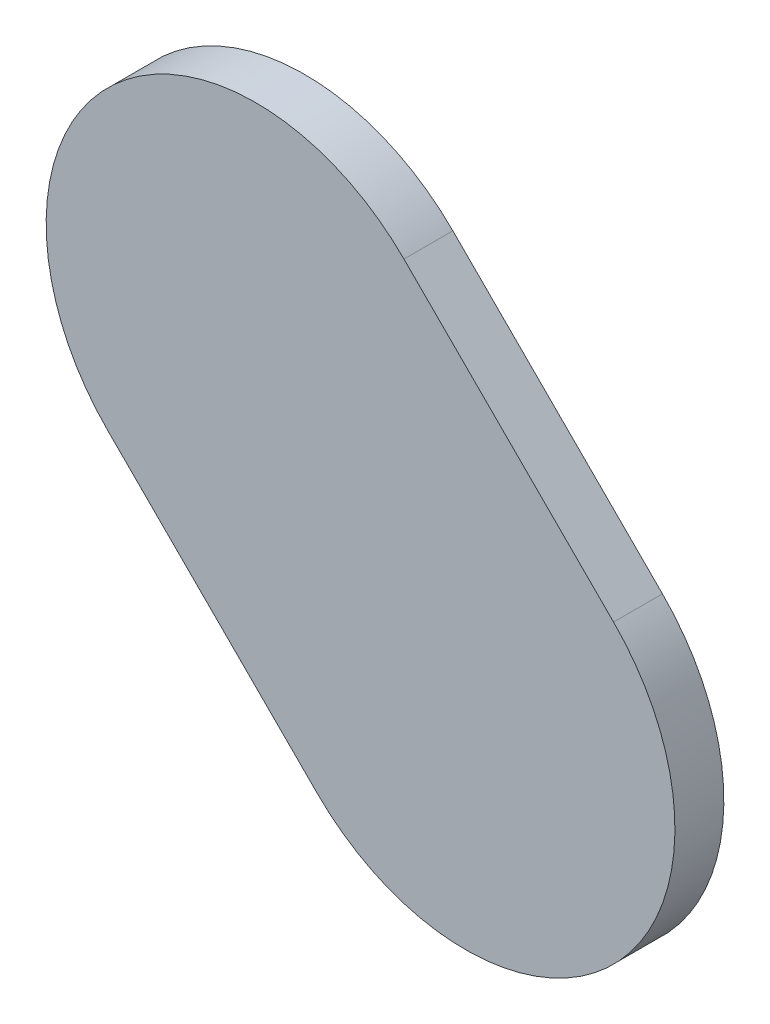
ISO-10303-21;
HEADER;
FILE_DESCRIPTION(('STEP AP214'),'2;1');
FILE_NAME('part.step','',(''),(''),'','','');
FILE_SCHEMA(('AUTOMOTIVE_DESIGN { 1 0 10303 214 1 1 1 1 }'));
ENDSEC;
DATA;
#1=APPLICATION_CONTEXT('core data for automotive mechanical design processes');
#2=APPLICATION_PROTOCOL_DEFINITION('international standard','automotive_design',2000,#1);
#3=PRODUCT_CONTEXT('',#1,'mechanical');
#4=PRODUCT('Part','Part','',(#3));
#5=PRODUCT_RELATED_PRODUCT_CATEGORY('part','',(#4));
#6=PRODUCT_DEFINITION_FORMATION('','',#4);
#7=PRODUCT_DEFINITION_CONTEXT('part definition',#1,'design');
#8=PRODUCT_DEFINITION('design','',#6,#7);
#9=PRODUCT_DEFINITION_SHAPE('','',#8);
#10=(LENGTH_UNIT() NAMED_UNIT(*) SI_UNIT(.MILLI.,.METRE.));
#11=(NAMED_UNIT(*) PLANE_ANGLE_UNIT() SI_UNIT($,.RADIAN.));
#12=(NAMED_UNIT(*) SI_UNIT($,.STERADIAN.) SOLID_ANGLE_UNIT());
#13=UNCERTAINTY_MEASURE_WITH_UNIT(LENGTH_MEASURE(1.E-05),#10,'distance_accuracy_value','');
#14=(GEOMETRIC_REPRESENTATION_CONTEXT(3) GLOBAL_UNCERTAINTY_ASSIGNED_CONTEXT((#13)) GLOBAL_UNIT_ASSIGNED_CONTEXT((#10,
#11,#12)) REPRESENTATION_CONTEXT('',''));
#15=CARTESIAN_POINT('',(0.,0.,0.));
#16=DIRECTION('',(0.,0.,1.));
#17=DIRECTION('',(1.,0.,0.));
#18=AXIS2_PLACEMENT_3D('',#15,#16,#17);
#19=CARTESIAN_POINT('',(121.666066,-62.893933,1.635));
#20=DIRECTION('',(0.,0.,1.));
#21=DIRECTION('',(1.,0.,0.));
#22=AXIS2_PLACEMENT_3D('',#19,#20,#21);
#23=PLANE('',#22);
#24=DIRECTION('',(-0.707106781186548,0.707106781186548,0.));
#25=VECTOR('',#24,1.);
#26=CARTESIAN_POINT('',(121.666066,-62.893933,1.635));
#27=LINE('',#26,#25);
#28=CARTESIAN_POINT('',(121.666066,-62.893933,1.635));
#29=VERTEX_POINT('',#28);
#30=CARTESIAN_POINT('',(121.516066,-62.743933,1.635));
#31=VERTEX_POINT('',#30);
#32=EDGE_CURVE('E82',#29,#31,#27,.T.);
#33=ORIENTED_EDGE('',*,*,#32,.T.);
#34=CARTESIAN_POINT('',(121.4099995,-62.8499995,1.635));
#35=DIRECTION('',(0.,0.,1.));
#36=DIRECTION('',(0.707106781186548,0.707106781186548,0.));
#37=AXIS2_PLACEMENT_3D('',#34,#35,#36);
#38=CIRCLE('',#37,0.150000682813);
#39=CARTESIAN_POINT('',(121.303933,-62.956066,1.635));
#40=VERTEX_POINT('',#39);
#41=EDGE_CURVE('E99',#31,#40,#38,.T.);
#42=ORIENTED_EDGE('',*,*,#41,.T.);
#43=DIRECTION('',(0.707106781186548,-0.707106781186548,0.));
#44=VECTOR('',#43,1.);
#45=CARTESIAN_POINT('',(121.303933,-62.956066,1.635));
#46=LINE('',#45,#44);
#47=CARTESIAN_POINT('',(121.453933,-63.106066,1.635));
#48=VERTEX_POINT('',#47);
#49=EDGE_CURVE('E75',#40,#48,#46,.T.);
#50=ORIENTED_EDGE('',*,*,#49,.T.);
#51=CARTESIAN_POINT('',(121.5599995,-62.9999995,1.635));
#52=DIRECTION('',(0.,0.,1.));
#53=DIRECTION('',(-0.707106781186548,-0.707106781186548,0.));
#54=AXIS2_PLACEMENT_3D('',#51,#52,#53);
#55=CIRCLE('',#54,0.150000682813);
#56=EDGE_CURVE('E11',#48,#29,#55,.T.);
#57=ORIENTED_EDGE('',*,*,#56,.T.);
#58=EDGE_LOOP('',(#33,#42,#50,#57));
#59=FACE_BOUND('',#58,.T.);
#60=ADVANCED_FACE('F17',(#59),#23,.T.);
#61=CARTESIAN_POINT('',(121.666066,-62.893933,1.6));
#62=DIRECTION('',(0.,0.,1.));
#63=DIRECTION('',(1.,0.,0.));
#64=AXIS2_PLACEMENT_3D('',#61,#62,#63);
#65=PLANE('',#64);
#66=CARTESIAN_POINT('',(121.5599995,-62.9999995,1.6));
#67=DIRECTION('',(0.,0.,1.));
#68=DIRECTION('',(-0.707106781186548,-0.707106781186548,0.));
#69=AXIS2_PLACEMENT_3D('',#66,#67,#68);
#70=CIRCLE('',#69,0.150000682813);
#71=CARTESIAN_POINT('',(121.453933,-63.106066,1.6));
#72=VERTEX_POINT('',#71);
#73=CARTESIAN_POINT('',(121.666066,-62.893933,1.6));
#74=VERTEX_POINT('',#73);
#75=EDGE_CURVE('E20',#72,#74,#70,.T.);
#76=ORIENTED_EDGE('',*,*,#75,.F.);
#77=DIRECTION('',(0.707106781186548,-0.707106781186548,0.));
#78=VECTOR('',#77,1.);
#79=CARTESIAN_POINT('',(121.303933,-62.956066,1.6));
#80=LINE('',#79,#78);
#81=CARTESIAN_POINT('',(121.303933,-62.956066,1.6));
#82=VERTEX_POINT('',#81);
#83=EDGE_CURVE('E103',#82,#72,#80,.T.);
#84=ORIENTED_EDGE('',*,*,#83,.F.);
#85=CARTESIAN_POINT('',(121.4099995,-62.8499995,1.6));
#86=DIRECTION('',(0.,0.,1.));
#87=DIRECTION('',(0.707106781186548,0.707106781186548,0.));
#88=AXIS2_PLACEMENT_3D('',#85,#86,#87);
#89=CIRCLE('',#88,0.150000682813);
#90=CARTESIAN_POINT('',(121.516066,-62.743933,1.6));
#91=VERTEX_POINT('',#90);
#92=EDGE_CURVE('E84',#91,#82,#89,.T.);
#93=ORIENTED_EDGE('',*,*,#92,.F.);
#94=DIRECTION('',(-0.707106781186548,0.707106781186548,0.));
#95=VECTOR('',#94,1.);
#96=CARTESIAN_POINT('',(121.666066,-62.893933,1.6));
#97=LINE('',#96,#95);
#98=EDGE_CURVE('E80',#74,#91,#97,.T.);
#99=ORIENTED_EDGE('',*,*,#98,.F.);
#100=EDGE_LOOP('',(#76,#84,#93,#99));
#101=FACE_BOUND('',#100,.T.);
#102=ADVANCED_FACE('F86',(#101),#65,.F.);
#103=CARTESIAN_POINT('',(121.5599995,-62.9999995,1.6));
#104=DIRECTION('',(0.,0.,-1.));
#105=DIRECTION('',(-0.707106781186548,-0.707106781186548,0.));
#106=AXIS2_PLACEMENT_3D('',#103,#104,#105);
#107=CYLINDRICAL_SURFACE('',#106,0.150000682813);
#108=ORIENTED_EDGE('',*,*,#75,.T.);
#109=DIRECTION('',(0.,0.,1.));
#110=VECTOR('',#109,1.);
#111=CARTESIAN_POINT('',(121.666066,-62.893933,1.6));
#112=LINE('',#111,#110);
#113=EDGE_CURVE('E69',#74,#29,#112,.T.);
#114=ORIENTED_EDGE('',*,*,#113,.T.);
#115=ORIENTED_EDGE('',*,*,#56,.F.);
#116=DIRECTION('',(0.,0.,1.));
#117=VECTOR('',#116,1.);
#118=CARTESIAN_POINT('',(121.453933,-63.106066,1.6));
#119=LINE('',#118,#117);
#120=EDGE_CURVE('E72',#72,#48,#119,.T.);
#121=ORIENTED_EDGE('',*,*,#120,.F.);
#122=EDGE_LOOP('',(#108,#114,#115,#121));
#123=FACE_BOUND('',#122,.T.);
#124=ADVANCED_FACE('F68',(#123),#107,.T.);
#125=CARTESIAN_POINT('',(121.303933,-62.956066,1.6));
#126=DIRECTION('',(0.707106781186548,0.707106781186548,0.));
#127=DIRECTION('',(0.,0.,-1.));
#128=AXIS2_PLACEMENT_3D('',#125,#126,#127);
#129=PLANE('',#128);
#130=ORIENTED_EDGE('',*,*,#83,.T.);
#131=ORIENTED_EDGE('',*,*,#120,.T.);
#132=ORIENTED_EDGE('',*,*,#49,.F.);
#133=DIRECTION('',(0.,0.,1.));
#134=VECTOR('',#133,1.);
#135=CARTESIAN_POINT('',(121.303933,-62.956066,1.6));
#136=LINE('',#135,#134);
#137=EDGE_CURVE('E104',#82,#40,#136,.T.);
#138=ORIENTED_EDGE('',*,*,#137,.F.);
#139=EDGE_LOOP('',(#130,#131,#132,#138));
#140=FACE_BOUND('',#139,.T.);
#141=ADVANCED_FACE('F122',(#140),#129,.F.);
#142=CARTESIAN_POINT('',(121.4099995,-62.8499995,1.6));
#143=DIRECTION('',(0.,0.,-1.));
#144=DIRECTION('',(0.707106781186548,0.707106781186548,0.));
#145=AXIS2_PLACEMENT_3D('',#142,#143,#144);
#146=CYLINDRICAL_SURFACE('',#145,0.150000682813);
#147=ORIENTED_EDGE('',*,*,#92,.T.);
#148=ORIENTED_EDGE('',*,*,#137,.T.);
#149=ORIENTED_EDGE('',*,*,#41,.F.);
#150=DIRECTION('',(0.,0.,1.));
#151=VECTOR('',#150,1.);
#152=CARTESIAN_POINT('',(121.516066,-62.743933,1.6));
#153=LINE('',#152,#151);
#154=EDGE_CURVE('E90',#91,#31,#153,.T.);
#155=ORIENTED_EDGE('',*,*,#154,.F.);
#156=EDGE_LOOP('',(#147,#148,#149,#155));
#157=FACE_BOUND('',#156,.T.);
#158=ADVANCED_FACE('F124',(#157),#146,.T.);
#159=CARTESIAN_POINT('',(121.666066,-62.893933,1.6));
#160=DIRECTION('',(-0.707106781186548,-0.707106781186548,0.));
#161=DIRECTION('',(-0.707106781186548,0.707106781186548,0.));
#162=AXIS2_PLACEMENT_3D('',#159,#160,#161);
#163=PLANE('',#162);
#164=ORIENTED_EDGE('',*,*,#98,.T.);
#165=ORIENTED_EDGE('',*,*,#154,.T.);
#166=ORIENTED_EDGE('',*,*,#32,.F.);
#167=ORIENTED_EDGE('',*,*,#113,.F.);
#168=EDGE_LOOP('',(#164,#165,#166,#167));
#169=FACE_BOUND('',#168,.T.);
#170=ADVANCED_FACE('F78',(#169),#163,.F.);
#171=CLOSED_SHELL('',(#60,#102,#124,#141,#158,#170));
#172=MANIFOLD_SOLID_BREP('B1',#171);
#173=ADVANCED_BREP_SHAPE_REPRESENTATION('',(#18,#172),#14);
#174=SHAPE_DEFINITION_REPRESENTATION(#9,#173);
ENDSEC;
END-ISO-10303-21;
